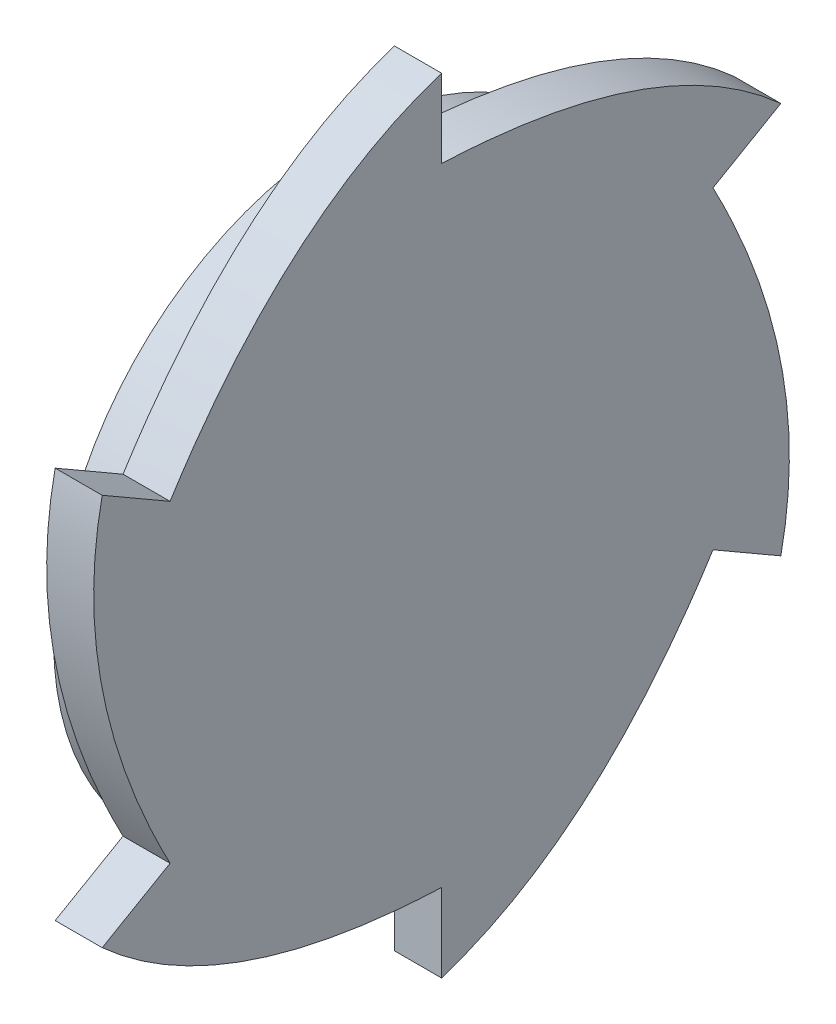
ISO-10303-21;
HEADER;
FILE_DESCRIPTION(('STEP AP214'),'2;1');
FILE_NAME('part.step','',(''),(''),'','','');
FILE_SCHEMA(('AUTOMOTIVE_DESIGN { 1 0 10303 214 1 1 1 1 }'));
ENDSEC;
DATA;
#1=APPLICATION_CONTEXT('core data for automotive mechanical design processes');
#2=APPLICATION_PROTOCOL_DEFINITION('international standard','automotive_design',2000,#1);
#3=PRODUCT_CONTEXT('',#1,'mechanical');
#4=PRODUCT('Part','Part','',(#3));
#5=PRODUCT_RELATED_PRODUCT_CATEGORY('part','',(#4));
#6=PRODUCT_DEFINITION_FORMATION('','',#4);
#7=PRODUCT_DEFINITION_CONTEXT('part definition',#1,'design');
#8=PRODUCT_DEFINITION('design','',#6,#7);
#9=PRODUCT_DEFINITION_SHAPE('','',#8);
#10=(LENGTH_UNIT() NAMED_UNIT(*) SI_UNIT(.MILLI.,.METRE.));
#11=(NAMED_UNIT(*) PLANE_ANGLE_UNIT() SI_UNIT($,.RADIAN.));
#12=(NAMED_UNIT(*) SI_UNIT($,.STERADIAN.) SOLID_ANGLE_UNIT());
#13=UNCERTAINTY_MEASURE_WITH_UNIT(LENGTH_MEASURE(1.E-05),#10,'distance_accuracy_value','');
#14=(GEOMETRIC_REPRESENTATION_CONTEXT(3) GLOBAL_UNCERTAINTY_ASSIGNED_CONTEXT((#13)) GLOBAL_UNIT_ASSIGNED_CONTEXT((#10,
#11,#12)) REPRESENTATION_CONTEXT('',''));
#15=CARTESIAN_POINT('',(0.,0.,0.));
#16=DIRECTION('',(0.,0.,1.));
#17=DIRECTION('',(1.,0.,0.));
#18=AXIS2_PLACEMENT_3D('',#15,#16,#17);
#19=CARTESIAN_POINT('',(30.,125.000008720302,-216.506355505871));
#20=CARTESIAN_POINT('',(30.,194.506368363317,-139.457587718134));
#21=CARTESIAN_POINT('',(30.,200.000008720303,-4.55976157299443E-06));
#22=B_SPLINE_CURVE_WITH_KNOTS('',2,(#19,#20,#21),.UNSPECIFIED.,.F.,.F.,(3,3),(0.,
0.458760962195231),.UNSPECIFIED.);
#23=DIRECTION('',(-1.,0.,0.));
#24=VECTOR('',#23,1.);
#25=SURFACE_OF_LINEAR_EXTRUSION('',#22,#24);
#26=CARTESIAN_POINT('',(0.,125.000008720302,-216.506355505871));
#27=CARTESIAN_POINT('',(0.,194.506368363317,-139.457587718134));
#28=CARTESIAN_POINT('',(0.,200.000008720303,-4.55976157299443E-06));
#29=B_SPLINE_CURVE_WITH_KNOTS('',2,(#26,#27,#28),.UNSPECIFIED.,.F.,.F.,(3,3),(0.,
0.458760962195231),.UNSPECIFIED.);
#30=CARTESIAN_POINT('',(0.,125.000008720302,-216.506355505871));
#31=VERTEX_POINT('',#30);
#32=CARTESIAN_POINT('',(0.,200.000008720303,-4.55976157299443E-06));
#33=VERTEX_POINT('',#32);
#34=EDGE_CURVE('E153',#31,#33,#29,.T.);
#35=ORIENTED_EDGE('',*,*,#34,.T.);
#36=DIRECTION('',(-1.,0.,0.));
#37=VECTOR('',#36,1.);
#38=CARTESIAN_POINT('',(30.,200.000008720303,-4.55976157299443E-06));
#39=LINE('',#38,#37);
#40=CARTESIAN_POINT('',(30.,200.000008720303,-4.55976157299443E-06));
#41=VERTEX_POINT('',#40);
#42=EDGE_CURVE('E46',#41,#33,#39,.T.);
#43=ORIENTED_EDGE('',*,*,#42,.F.);
#44=CARTESIAN_POINT('',(30.,125.000008720302,-216.506355505871));
#45=CARTESIAN_POINT('',(30.,194.506368363317,-139.457587718134));
#46=CARTESIAN_POINT('',(30.,200.000008720303,-4.55976157299443E-06));
#47=B_SPLINE_CURVE_WITH_KNOTS('',2,(#44,#45,#46),.UNSPECIFIED.,.F.,.F.,(3,3),(0.,
0.458760962195231),.UNSPECIFIED.);
#48=CARTESIAN_POINT('',(30.,125.000008720302,-216.506355505871));
#49=VERTEX_POINT('',#48);
#50=EDGE_CURVE('E273',#49,#41,#47,.T.);
#51=ORIENTED_EDGE('',*,*,#50,.F.);
#52=DIRECTION('',(-1.,0.,0.));
#53=VECTOR('',#52,1.);
#54=CARTESIAN_POINT('',(30.,125.000008720302,-216.506355505871));
#55=LINE('',#54,#53);
#56=EDGE_CURVE('E265',#49,#31,#55,.T.);
#57=ORIENTED_EDGE('',*,*,#56,.T.);
#58=EDGE_LOOP('',(#35,#43,#51,#57));
#59=FACE_BOUND('',#58,.T.);
#60=ADVANCED_FACE('F35',(#59),#25,.F.);
#61=CARTESIAN_POINT('',(30.,200.000008720303,-4.55976157299443E-06));
#62=DIRECTION('',(0.,0.,1.));
#63=DIRECTION('',(1.,0.,0.));
#64=AXIS2_PLACEMENT_3D('',#61,#62,#63);
#65=PLANE('',#64);
#66=DIRECTION('',(0.,1.,0.));
#67=VECTOR('',#66,1.);
#68=CARTESIAN_POINT('',(0.,200.000008720303,-4.55976157299443E-06));
#69=LINE('',#68,#67);
#70=CARTESIAN_POINT('',(0.,250.000008720303,-4.55976157299443E-06));
#71=VERTEX_POINT('',#70);
#72=EDGE_CURVE('E142',#33,#71,#69,.T.);
#73=ORIENTED_EDGE('',*,*,#72,.T.);
#74=DIRECTION('',(-1.,0.,0.));
#75=VECTOR('',#74,1.);
#76=CARTESIAN_POINT('',(30.,250.000008720303,-4.55976157299443E-06));
#77=LINE('',#76,#75);
#78=CARTESIAN_POINT('',(30.,250.000008720303,-4.55976157299443E-06));
#79=VERTEX_POINT('',#78);
#80=EDGE_CURVE('E145',#79,#71,#77,.T.);
#81=ORIENTED_EDGE('',*,*,#80,.F.);
#82=DIRECTION('',(0.,1.,0.));
#83=VECTOR('',#82,1.);
#84=CARTESIAN_POINT('',(30.,200.000008720303,-4.55976157299443E-06));
#85=LINE('',#84,#83);
#86=EDGE_CURVE('E173',#41,#79,#85,.T.);
#87=ORIENTED_EDGE('',*,*,#86,.F.);
#88=ORIENTED_EDGE('',*,*,#42,.T.);
#89=EDGE_LOOP('',(#73,#81,#87,#88));
#90=FACE_BOUND('',#89,.T.);
#91=ADVANCED_FACE('F144',(#90),#65,.F.);
#92=CARTESIAN_POINT('',(30.,250.000008720303,-4.55976157299443E-06));
#93=CARTESIAN_POINT('',(30.,218.026998307343,98.718652509536));
#94=CARTESIAN_POINT('',(30.,100.000008720303,173.205076197127));
#95=B_SPLINE_CURVE_WITH_KNOTS('',2,(#92,#93,#94),.UNSPECIFIED.,.F.,.F.,(3,3),(0.,
0.458760962195231),.UNSPECIFIED.);
#96=DIRECTION('',(-1.,0.,0.));
#97=VECTOR('',#96,1.);
#98=SURFACE_OF_LINEAR_EXTRUSION('',#95,#97);
#99=CARTESIAN_POINT('',(0.,250.000008720303,-4.55976157299443E-06));
#100=CARTESIAN_POINT('',(0.,218.026998307343,98.718652509536));
#101=CARTESIAN_POINT('',(0.,100.000008720303,173.205076197127));
#102=B_SPLINE_CURVE_WITH_KNOTS('',2,(#99,#100,#101),.UNSPECIFIED.,.F.,.F.,(3,3),(0.,
0.458760962195231),.UNSPECIFIED.);
#103=CARTESIAN_POINT('',(0.,100.000008720303,173.205076197127));
#104=VERTEX_POINT('',#103);
#105=EDGE_CURVE('E152',#71,#104,#102,.T.);
#106=ORIENTED_EDGE('',*,*,#105,.T.);
#107=DIRECTION('',(-1.,0.,0.));
#108=VECTOR('',#107,1.);
#109=CARTESIAN_POINT('',(30.,100.000008720303,173.205076197127));
#110=LINE('',#109,#108);
#111=CARTESIAN_POINT('',(30.,100.000008720303,173.205076197127));
#112=VERTEX_POINT('',#111);
#113=EDGE_CURVE('E160',#112,#104,#110,.T.);
#114=ORIENTED_EDGE('',*,*,#113,.F.);
#115=CARTESIAN_POINT('',(30.,250.000008720303,-4.55976157299443E-06));
#116=CARTESIAN_POINT('',(30.,218.026998307343,98.718652509536));
#117=CARTESIAN_POINT('',(30.,100.000008720303,173.205076197127));
#118=B_SPLINE_CURVE_WITH_KNOTS('',2,(#115,#116,#117),.UNSPECIFIED.,.F.,.F.,(3,3),(0.,
0.458760962195231),.UNSPECIFIED.);
#119=EDGE_CURVE('E159',#79,#112,#118,.T.);
#120=ORIENTED_EDGE('',*,*,#119,.F.);
#121=ORIENTED_EDGE('',*,*,#80,.T.);
#122=EDGE_LOOP('',(#106,#114,#120,#121));
#123=FACE_BOUND('',#122,.T.);
#124=ADVANCED_FACE('F156',(#123),#98,.F.);
#125=CARTESIAN_POINT('',(30.,100.000008720303,173.205076197127));
#126=DIRECTION('',(0.,-0.866025403784405,0.500000000000058));
#127=DIRECTION('',(0.,-0.500000000000058,-0.866025403784405));
#128=AXIS2_PLACEMENT_3D('',#125,#126,#127);
#129=PLANE('',#128);
#130=DIRECTION('',(0.,0.500000000000058,0.866025403784405));
#131=VECTOR('',#130,1.);
#132=CARTESIAN_POINT('',(0.,100.000008720303,173.205076197127));
#133=LINE('',#132,#131);
#134=CARTESIAN_POINT('',(0.,125.000008720305,216.506346386347));
#135=VERTEX_POINT('',#134);
#136=EDGE_CURVE('E165',#104,#135,#133,.T.);
#137=ORIENTED_EDGE('',*,*,#136,.T.);
#138=DIRECTION('',(-1.,0.,0.));
#139=VECTOR('',#138,1.);
#140=CARTESIAN_POINT('',(30.,125.000008720305,216.506346386347));
#141=LINE('',#140,#139);
#142=CARTESIAN_POINT('',(30.,125.000008720305,216.506346386347));
#143=VERTEX_POINT('',#142);
#144=EDGE_CURVE('E178',#143,#135,#141,.T.);
#145=ORIENTED_EDGE('',*,*,#144,.F.);
#146=DIRECTION('',(0.,0.500000000000058,0.866025403784405));
#147=VECTOR('',#146,1.);
#148=CARTESIAN_POINT('',(30.,100.000008720303,173.205076197127));
#149=LINE('',#148,#147);
#150=EDGE_CURVE('E181',#112,#143,#149,.T.);
#151=ORIENTED_EDGE('',*,*,#150,.F.);
#152=ORIENTED_EDGE('',*,*,#113,.T.);
#153=EDGE_LOOP('',(#137,#145,#151,#152));
#154=FACE_BOUND('',#153,.T.);
#155=ADVANCED_FACE('F297',(#154),#129,.F.);
#156=CARTESIAN_POINT('',(30.,125.000008720303,216.506346386349));
#157=CARTESIAN_POINT('',(30.,23.5206386643267,238.176235667909));
#158=CARTESIAN_POINT('',(30.,-99.9999912796977,173.205076197127));
#159=B_SPLINE_CURVE_WITH_KNOTS('',2,(#156,#157,#158),.UNSPECIFIED.,.F.,.F.,(3,3),(0.,
0.458760962195231),.UNSPECIFIED.);
#160=DIRECTION('',(-1.,0.,0.));
#161=VECTOR('',#160,1.);
#162=SURFACE_OF_LINEAR_EXTRUSION('',#159,#161);
#163=CARTESIAN_POINT('',(0.,125.000008720303,216.506346386349));
#164=CARTESIAN_POINT('',(0.,23.5206386643267,238.176235667909));
#165=CARTESIAN_POINT('',(0.,-99.9999912796977,173.205076197127));
#166=B_SPLINE_CURVE_WITH_KNOTS('',2,(#163,#164,#165),.UNSPECIFIED.,.F.,.F.,(3,3),(0.,
0.458760962195231),.UNSPECIFIED.);
#167=CARTESIAN_POINT('',(0.,-99.9999912796977,173.205076197127));
#168=VERTEX_POINT('',#167);
#169=EDGE_CURVE('E167',#135,#168,#166,.T.);
#170=ORIENTED_EDGE('',*,*,#169,.T.);
#171=DIRECTION('',(-1.,0.,0.));
#172=VECTOR('',#171,1.);
#173=CARTESIAN_POINT('',(30.,-99.9999912796977,173.205076197127));
#174=LINE('',#173,#172);
#175=CARTESIAN_POINT('',(30.,-99.9999912796977,173.205076197127));
#176=VERTEX_POINT('',#175);
#177=EDGE_CURVE('E188',#176,#168,#174,.T.);
#178=ORIENTED_EDGE('',*,*,#177,.F.);
#179=CARTESIAN_POINT('',(30.,125.000008720303,216.506346386349));
#180=CARTESIAN_POINT('',(30.,23.5206386643267,238.176235667909));
#181=CARTESIAN_POINT('',(30.,-99.9999912796977,173.205076197127));
#182=B_SPLINE_CURVE_WITH_KNOTS('',2,(#179,#180,#181),.UNSPECIFIED.,.F.,.F.,(3,3),(0.,
0.458760962195231),.UNSPECIFIED.);
#183=EDGE_CURVE('E190',#143,#176,#182,.T.);
#184=ORIENTED_EDGE('',*,*,#183,.F.);
#185=ORIENTED_EDGE('',*,*,#144,.T.);
#186=EDGE_LOOP('',(#170,#178,#184,#185));
#187=FACE_BOUND('',#186,.T.);
#188=ADVANCED_FACE('F300',(#187),#162,.F.);
#189=CARTESIAN_POINT('',(30.,-99.9999912796977,173.205076197127));
#190=DIRECTION('',(0.,-0.866025403784462,-0.499999999999959));
#191=DIRECTION('',(0.,0.499999999999959,-0.866025403784462));
#192=AXIS2_PLACEMENT_3D('',#189,#190,#191);
#193=PLANE('',#192);
#194=DIRECTION('',(0.,-0.499999999999959,0.866025403784462));
#195=VECTOR('',#194,1.);
#196=CARTESIAN_POINT('',(0.,-99.9999912796977,173.205076197127));
#197=LINE('',#196,#195);
#198=CARTESIAN_POINT('',(0.,-124.999991279695,216.506346386349));
#199=VERTEX_POINT('',#198);
#200=EDGE_CURVE('E194',#168,#199,#197,.T.);
#201=ORIENTED_EDGE('',*,*,#200,.T.);
#202=DIRECTION('',(-1.,0.,0.));
#203=VECTOR('',#202,1.);
#204=CARTESIAN_POINT('',(30.,-124.999991279695,216.506346386349));
#205=LINE('',#204,#203);
#206=CARTESIAN_POINT('',(30.,-124.999991279695,216.506346386349));
#207=VERTEX_POINT('',#206);
#208=EDGE_CURVE('E200',#207,#199,#205,.T.);
#209=ORIENTED_EDGE('',*,*,#208,.F.);
#210=DIRECTION('',(0.,-0.499999999999959,0.866025403784462));
#211=VECTOR('',#210,1.);
#212=CARTESIAN_POINT('',(30.,-99.9999912796977,173.205076197127));
#213=LINE('',#212,#211);
#214=EDGE_CURVE('E204',#176,#207,#213,.T.);
#215=ORIENTED_EDGE('',*,*,#214,.F.);
#216=ORIENTED_EDGE('',*,*,#177,.T.);
#217=EDGE_LOOP('',(#201,#209,#215,#216));
#218=FACE_BOUND('',#217,.T.);
#219=ADVANCED_FACE('F304',(#218),#193,.F.);
#220=CARTESIAN_POINT('',(30.,-124.999991279698,216.506346386349));
#221=CARTESIAN_POINT('',(30.,-194.506350922713,139.457578598612));
#222=CARTESIAN_POINT('',(30.,-199.999991279698,-4.55976093135355E-06));
#223=B_SPLINE_CURVE_WITH_KNOTS('',2,(#220,#221,#222),.UNSPECIFIED.,.F.,.F.,(3,3),(0.,
0.458760962195231),.UNSPECIFIED.);
#224=DIRECTION('',(-1.,0.,0.));
#225=VECTOR('',#224,1.);
#226=SURFACE_OF_LINEAR_EXTRUSION('',#223,#225);
#227=CARTESIAN_POINT('',(0.,-124.999991279698,216.506346386349));
#228=CARTESIAN_POINT('',(0.,-194.506350922713,139.457578598612));
#229=CARTESIAN_POINT('',(0.,-199.999991279698,-4.55976093135355E-06));
#230=B_SPLINE_CURVE_WITH_KNOTS('',2,(#227,#228,#229),.UNSPECIFIED.,.F.,.F.,(3,3),(0.,
0.458760962195231),.UNSPECIFIED.);
#231=CARTESIAN_POINT('',(0.,-199.999991279698,-4.55976093135355E-06));
#232=VERTEX_POINT('',#231);
#233=EDGE_CURVE('E209',#199,#232,#230,.T.);
#234=ORIENTED_EDGE('',*,*,#233,.T.);
#235=DIRECTION('',(-1.,0.,0.));
#236=VECTOR('',#235,1.);
#237=CARTESIAN_POINT('',(30.,-199.999991279698,-4.55976093135355E-06));
#238=LINE('',#237,#236);
#239=CARTESIAN_POINT('',(30.,-199.999991279698,-4.55976093135355E-06));
#240=VERTEX_POINT('',#239);
#241=EDGE_CURVE('E212',#240,#232,#238,.T.);
#242=ORIENTED_EDGE('',*,*,#241,.F.);
#243=CARTESIAN_POINT('',(30.,-124.999991279698,216.506346386349));
#244=CARTESIAN_POINT('',(30.,-194.506350922713,139.457578598612));
#245=CARTESIAN_POINT('',(30.,-199.999991279698,-4.55976093135355E-06));
#246=B_SPLINE_CURVE_WITH_KNOTS('',2,(#243,#244,#245),.UNSPECIFIED.,.F.,.F.,(3,3),(0.,
0.458760962195231),.UNSPECIFIED.);
#247=EDGE_CURVE('E214',#207,#240,#246,.T.);
#248=ORIENTED_EDGE('',*,*,#247,.F.);
#249=ORIENTED_EDGE('',*,*,#208,.T.);
#250=EDGE_LOOP('',(#234,#242,#248,#249));
#251=FACE_BOUND('',#250,.T.);
#252=ADVANCED_FACE('F323',(#251),#226,.F.);
#253=CARTESIAN_POINT('',(30.,-199.999991279698,-4.55976093135355E-06));
#254=DIRECTION('',(0.,0.,-1.));
#255=DIRECTION('',(0.,1.,0.));
#256=AXIS2_PLACEMENT_3D('',#253,#254,#255);
#257=PLANE('',#256);
#258=DIRECTION('',(0.,-1.,0.));
#259=VECTOR('',#258,1.);
#260=CARTESIAN_POINT('',(0.,-199.999991279698,-4.55976093135355E-06));
#261=LINE('',#260,#259);
#262=CARTESIAN_POINT('',(0.,-249.999991279697,-4.55975985561819E-06));
#263=VERTEX_POINT('',#262);
#264=EDGE_CURVE('E218',#232,#263,#261,.T.);
#265=ORIENTED_EDGE('',*,*,#264,.T.);
#266=DIRECTION('',(-1.,0.,0.));
#267=VECTOR('',#266,1.);
#268=CARTESIAN_POINT('',(30.,-249.999991279697,-4.55975985561819E-06));
#269=LINE('',#268,#267);
#270=CARTESIAN_POINT('',(30.,-249.999991279697,-4.55975985561819E-06));
#271=VERTEX_POINT('',#270);
#272=EDGE_CURVE('E224',#271,#263,#269,.T.);
#273=ORIENTED_EDGE('',*,*,#272,.F.);
#274=DIRECTION('',(0.,-1.,0.));
#275=VECTOR('',#274,1.);
#276=CARTESIAN_POINT('',(30.,-199.999991279698,-4.55976093135355E-06));
#277=LINE('',#276,#275);
#278=EDGE_CURVE('E228',#240,#271,#277,.T.);
#279=ORIENTED_EDGE('',*,*,#278,.F.);
#280=ORIENTED_EDGE('',*,*,#241,.T.);
#281=EDGE_LOOP('',(#265,#273,#279,#280));
#282=FACE_BOUND('',#281,.T.);
#283=ADVANCED_FACE('F326',(#282),#257,.F.);
#284=CARTESIAN_POINT('',(30.,-249.999991279698,-4.55976093747679E-06));
#285=CARTESIAN_POINT('',(30.,-218.026980866737,-98.7186616290583));
#286=CARTESIAN_POINT('',(30.,-99.9999912796982,-173.205085316649));
#287=B_SPLINE_CURVE_WITH_KNOTS('',2,(#284,#285,#286),.UNSPECIFIED.,.F.,.F.,(3,3),(0.,
0.458760962195231),.UNSPECIFIED.);
#288=DIRECTION('',(-1.,0.,0.));
#289=VECTOR('',#288,1.);
#290=SURFACE_OF_LINEAR_EXTRUSION('',#287,#289);
#291=CARTESIAN_POINT('',(0.,-249.999991279698,-4.55976093747679E-06));
#292=CARTESIAN_POINT('',(0.,-218.026980866737,-98.7186616290583));
#293=CARTESIAN_POINT('',(0.,-99.9999912796982,-173.205085316649));
#294=B_SPLINE_CURVE_WITH_KNOTS('',2,(#291,#292,#293),.UNSPECIFIED.,.F.,.F.,(3,3),(0.,
0.458760962195231),.UNSPECIFIED.);
#295=CARTESIAN_POINT('',(0.,-99.9999912796982,-173.205085316649));
#296=VERTEX_POINT('',#295);
#297=EDGE_CURVE('E233',#263,#296,#294,.T.);
#298=ORIENTED_EDGE('',*,*,#297,.T.);
#299=DIRECTION('',(-1.,0.,0.));
#300=VECTOR('',#299,1.);
#301=CARTESIAN_POINT('',(30.,-99.9999912796982,-173.205085316649));
#302=LINE('',#301,#300);
#303=CARTESIAN_POINT('',(30.,-99.9999912796982,-173.205085316649));
#304=VERTEX_POINT('',#303);
#305=EDGE_CURVE('E236',#304,#296,#302,.T.);
#306=ORIENTED_EDGE('',*,*,#305,.F.);
#307=CARTESIAN_POINT('',(30.,-249.999991279698,-4.55976093747679E-06));
#308=CARTESIAN_POINT('',(30.,-218.026980866737,-98.7186616290583));
#309=CARTESIAN_POINT('',(30.,-99.9999912796982,-173.205085316649));
#310=B_SPLINE_CURVE_WITH_KNOTS('',2,(#307,#308,#309),.UNSPECIFIED.,.F.,.F.,(3,3),(0.,
0.458760962195231),.UNSPECIFIED.);
#311=EDGE_CURVE('E238',#271,#304,#310,.T.);
#312=ORIENTED_EDGE('',*,*,#311,.F.);
#313=ORIENTED_EDGE('',*,*,#272,.T.);
#314=EDGE_LOOP('',(#298,#306,#312,#313));
#315=FACE_BOUND('',#314,.T.);
#316=ADVANCED_FACE('F330',(#315),#290,.F.);
#317=CARTESIAN_POINT('',(30.,-99.9999912796982,-173.205085316649));
#318=DIRECTION('',(0.,0.866025403784437,-0.500000000000004));
#319=DIRECTION('',(0.,0.500000000000004,0.866025403784436));
#320=AXIS2_PLACEMENT_3D('',#317,#318,#319);
#321=PLANE('',#320);
#322=DIRECTION('',(0.,-0.500000000000004,-0.866025403784436));
#323=VECTOR('',#322,1.);
#324=CARTESIAN_POINT('',(0.,-99.9999912796982,-173.205085316649));
#325=LINE('',#324,#323);
#326=CARTESIAN_POINT('',(0.,-124.999991279698,-216.506355505871));
#327=VERTEX_POINT('',#326);
#328=EDGE_CURVE('E90',#296,#327,#325,.T.);
#329=ORIENTED_EDGE('',*,*,#328,.T.);
#330=DIRECTION('',(-1.,0.,0.));
#331=VECTOR('',#330,1.);
#332=CARTESIAN_POINT('',(30.,-124.999991279698,-216.506355505871));
#333=LINE('',#332,#331);
#334=CARTESIAN_POINT('',(30.,-124.999991279698,-216.506355505871));
#335=VERTEX_POINT('',#334);
#336=EDGE_CURVE('E246',#335,#327,#333,.T.);
#337=ORIENTED_EDGE('',*,*,#336,.F.);
#338=DIRECTION('',(0.,-0.500000000000004,-0.866025403784436));
#339=VECTOR('',#338,1.);
#340=CARTESIAN_POINT('',(30.,-99.9999912796982,-173.205085316649));
#341=LINE('',#340,#339);
#342=EDGE_CURVE('E250',#304,#335,#341,.T.);
#343=ORIENTED_EDGE('',*,*,#342,.F.);
#344=ORIENTED_EDGE('',*,*,#305,.T.);
#345=EDGE_LOOP('',(#329,#337,#343,#344));
#346=FACE_BOUND('',#345,.T.);
#347=ADVANCED_FACE('F334',(#346),#321,.F.);
#348=CARTESIAN_POINT('',(30.,-124.999991279698,-216.506355505871));
#349=CARTESIAN_POINT('',(30.,-23.520621223722,-238.176244787431));
#350=CARTESIAN_POINT('',(30.,100.000008720302,-173.20508531665));
#351=B_SPLINE_CURVE_WITH_KNOTS('',2,(#348,#349,#350),.UNSPECIFIED.,.F.,.F.,(3,3),(0.,
0.458760962195231),.UNSPECIFIED.);
#352=DIRECTION('',(-1.,0.,0.));
#353=VECTOR('',#352,1.);
#354=SURFACE_OF_LINEAR_EXTRUSION('',#351,#353);
#355=CARTESIAN_POINT('',(0.,-124.999991279698,-216.506355505871));
#356=CARTESIAN_POINT('',(0.,-23.520621223722,-238.176244787431));
#357=CARTESIAN_POINT('',(0.,100.000008720302,-173.20508531665));
#358=B_SPLINE_CURVE_WITH_KNOTS('',2,(#355,#356,#357),.UNSPECIFIED.,.F.,.F.,(3,3),(0.,
0.458760962195231),.UNSPECIFIED.);
#359=CARTESIAN_POINT('',(0.,100.000008720302,-173.20508531665));
#360=VERTEX_POINT('',#359);
#361=EDGE_CURVE('E82',#327,#360,#358,.T.);
#362=ORIENTED_EDGE('',*,*,#361,.T.);
#363=DIRECTION('',(-1.,0.,0.));
#364=VECTOR('',#363,1.);
#365=CARTESIAN_POINT('',(30.,100.000008720302,-173.20508531665));
#366=LINE('',#365,#364);
#367=CARTESIAN_POINT('',(30.,100.000008720302,-173.20508531665));
#368=VERTEX_POINT('',#367);
#369=EDGE_CURVE('E256',#368,#360,#366,.T.);
#370=ORIENTED_EDGE('',*,*,#369,.F.);
#371=CARTESIAN_POINT('',(30.,-124.999991279698,-216.506355505871));
#372=CARTESIAN_POINT('',(30.,-23.520621223722,-238.176244787431));
#373=CARTESIAN_POINT('',(30.,100.000008720302,-173.20508531665));
#374=B_SPLINE_CURVE_WITH_KNOTS('',2,(#371,#372,#373),.UNSPECIFIED.,.F.,.F.,(3,3),(0.,
0.458760962195231),.UNSPECIFIED.);
#375=EDGE_CURVE('E60',#335,#368,#374,.T.);
#376=ORIENTED_EDGE('',*,*,#375,.F.);
#377=ORIENTED_EDGE('',*,*,#336,.T.);
#378=EDGE_LOOP('',(#362,#370,#376,#377));
#379=FACE_BOUND('',#378,.T.);
#380=ADVANCED_FACE('F338',(#379),#354,.F.);
#381=CARTESIAN_POINT('',(30.,100.000008720302,-173.20508531665));
#382=DIRECTION('',(0.,0.866025403784438,0.500000000000001));
#383=DIRECTION('',(0.,-0.500000000000001,0.866025403784438));
#384=AXIS2_PLACEMENT_3D('',#381,#382,#383);
#385=PLANE('',#384);
#386=DIRECTION('',(0.,0.500000000000001,-0.866025403784438));
#387=VECTOR('',#386,1.);
#388=CARTESIAN_POINT('',(0.,100.000008720302,-173.20508531665));
#389=LINE('',#388,#387);
#390=EDGE_CURVE('E72',#360,#31,#389,.T.);
#391=ORIENTED_EDGE('',*,*,#390,.T.);
#392=ORIENTED_EDGE('',*,*,#56,.F.);
#393=DIRECTION('',(0.,0.500000000000001,-0.866025403784438));
#394=VECTOR('',#393,1.);
#395=CARTESIAN_POINT('',(30.,100.000008720302,-173.20508531665));
#396=LINE('',#395,#394);
#397=EDGE_CURVE('E54',#368,#49,#396,.T.);
#398=ORIENTED_EDGE('',*,*,#397,.F.);
#399=ORIENTED_EDGE('',*,*,#369,.T.);
#400=EDGE_LOOP('',(#391,#392,#398,#399));
#401=FACE_BOUND('',#400,.T.);
#402=ADVANCED_FACE('F341',(#401),#385,.F.);
#403=CARTESIAN_POINT('',(30.,178.50318854181,-123.855383875475));
#404=DIRECTION('',(1.,0.,0.));
#405=DIRECTION('',(0.,0.,-1.));
#406=AXIS2_PLACEMENT_3D('',#403,#404,#405);
#407=PLANE('',#406);
#408=ORIENTED_EDGE('',*,*,#50,.T.);
#409=ORIENTED_EDGE('',*,*,#86,.T.);
#410=ORIENTED_EDGE('',*,*,#119,.T.);
#411=ORIENTED_EDGE('',*,*,#150,.T.);
#412=ORIENTED_EDGE('',*,*,#183,.T.);
#413=ORIENTED_EDGE('',*,*,#214,.T.);
#414=ORIENTED_EDGE('',*,*,#247,.T.);
#415=ORIENTED_EDGE('',*,*,#278,.T.);
#416=ORIENTED_EDGE('',*,*,#311,.T.);
#417=ORIENTED_EDGE('',*,*,#342,.T.);
#418=ORIENTED_EDGE('',*,*,#375,.T.);
#419=ORIENTED_EDGE('',*,*,#397,.T.);
#420=EDGE_LOOP('',(#408,#409,#410,#411,#412,#413,#414,#415,#416,#417,#418,#419));
#421=FACE_BOUND('',#420,.T.);
#422=ADVANCED_FACE('F344',(#421),#407,.T.);
#423=CARTESIAN_POINT('',(0.,178.50318854181,-123.855383875475));
#424=DIRECTION('',(1.,0.,0.));
#425=DIRECTION('',(0.,0.,-1.));
#426=AXIS2_PLACEMENT_3D('',#423,#424,#425);
#427=PLANE('',#426);
#428=CARTESIAN_POINT('',(0.,8.72030286933805E-06,-4.55976156832349E-06));
#429=DIRECTION('',(-1.,0.,0.));
#430=DIRECTION('',(0.,0.,1.));
#431=AXIS2_PLACEMENT_3D('',#428,#429,#430);
#432=CIRCLE('',#431,187.5);
#433=CARTESIAN_POINT('',(0.,8.72030286933805E-06,187.499995440238));
#434=VERTEX_POINT('',#433);
#435=EDGE_CURVE('E11',#434,#434,#432,.T.);
#436=ORIENTED_EDGE('',*,*,#435,.F.);
#437=EDGE_LOOP('',(#436));
#438=FACE_BOUND('',#437,.T.);
#439=ORIENTED_EDGE('',*,*,#34,.F.);
#440=ORIENTED_EDGE('',*,*,#390,.F.);
#441=ORIENTED_EDGE('',*,*,#361,.F.);
#442=ORIENTED_EDGE('',*,*,#328,.F.);
#443=ORIENTED_EDGE('',*,*,#297,.F.);
#444=ORIENTED_EDGE('',*,*,#264,.F.);
#445=ORIENTED_EDGE('',*,*,#233,.F.);
#446=ORIENTED_EDGE('',*,*,#200,.F.);
#447=ORIENTED_EDGE('',*,*,#169,.F.);
#448=ORIENTED_EDGE('',*,*,#136,.F.);
#449=ORIENTED_EDGE('',*,*,#105,.F.);
#450=ORIENTED_EDGE('',*,*,#72,.F.);
#451=EDGE_LOOP('',(#439,#440,#441,#442,#443,#444,#445,#446,#447,#448,#449,#450));
#452=FACE_BOUND('',#451,.T.);
#453=ADVANCED_FACE('F163',(#438,#452),#427,.F.);
#454=CARTESIAN_POINT('',(-30.,8.72030286933805E-06,-4.55976156832349E-06));
#455=DIRECTION('',(1.,0.,0.));
#456=DIRECTION('',(0.,1.,0.));
#457=AXIS2_PLACEMENT_3D('',#454,#455,#456);
#458=CYLINDRICAL_SURFACE('',#457,187.5);
#459=CARTESIAN_POINT('',(-30.,8.72030286933805E-06,-4.55976156832349E-06));
#460=DIRECTION('',(-1.,0.,0.));
#461=DIRECTION('',(0.,-1.,0.));
#462=AXIS2_PLACEMENT_3D('',#459,#460,#461);
#463=CIRCLE('',#462,187.5);
#464=CARTESIAN_POINT('',(-30.,-187.499991279697,-4.55976156832349E-06));
#465=VERTEX_POINT('',#464);
#466=EDGE_CURVE('E275',#465,#465,#463,.T.);
#467=ORIENTED_EDGE('',*,*,#466,.F.);
#468=EDGE_LOOP('',(#467));
#469=FACE_BOUND('',#468,.T.);
#470=ORIENTED_EDGE('',*,*,#435,.T.);
#471=EDGE_LOOP('',(#470));
#472=FACE_BOUND('',#471,.T.);
#473=ADVANCED_FACE('F348',(#469,#472),#458,.T.);
#474=CARTESIAN_POINT('',(-30.,8.72030285785699E-06,-4.55976157299443E-06));
#475=DIRECTION('',(-1.,0.,0.));
#476=DIRECTION('',(0.,0.,1.));
#477=AXIS2_PLACEMENT_3D('',#474,#475,#476);
#478=PLANE('',#477);
#479=ORIENTED_EDGE('',*,*,#466,.T.);
#480=EDGE_LOOP('',(#479));
#481=FACE_BOUND('',#480,.T.);
#482=ADVANCED_FACE('F37',(#481),#478,.T.);
#483=CLOSED_SHELL('',(#60,#91,#124,#155,#188,#219,#252,#283,#316,#347,#380,#402,#422,#453,#473,#482));
#484=MANIFOLD_SOLID_BREP('B2',#483);
#485=ADVANCED_BREP_SHAPE_REPRESENTATION('',(#18,#484),#14);
#486=SHAPE_DEFINITION_REPRESENTATION(#9,#485);
ENDSEC;
END-ISO-10303-21;
